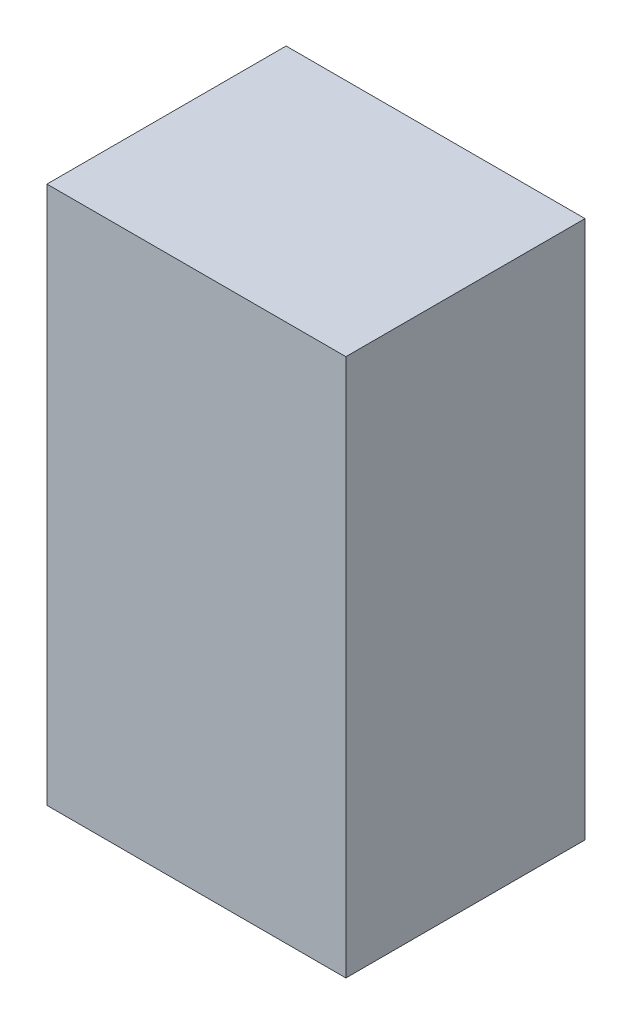
ISO-10303-21;
HEADER;
FILE_DESCRIPTION(('STEP AP214'),'2;1');
FILE_NAME('part.step','',(''),(''),'','','');
FILE_SCHEMA(('AUTOMOTIVE_DESIGN { 1 0 10303 214 1 1 1 1 }'));
ENDSEC;
DATA;
#1=APPLICATION_CONTEXT('core data for automotive mechanical design processes');
#2=APPLICATION_PROTOCOL_DEFINITION('international standard','automotive_design',2000,#1);
#3=PRODUCT_CONTEXT('',#1,'mechanical');
#4=PRODUCT('Part','Part','',(#3));
#5=PRODUCT_RELATED_PRODUCT_CATEGORY('part','',(#4));
#6=PRODUCT_DEFINITION_FORMATION('','',#4);
#7=PRODUCT_DEFINITION_CONTEXT('part definition',#1,'design');
#8=PRODUCT_DEFINITION('design','',#6,#7);
#9=PRODUCT_DEFINITION_SHAPE('','',#8);
#10=(LENGTH_UNIT() NAMED_UNIT(*) SI_UNIT(.MILLI.,.METRE.));
#11=(NAMED_UNIT(*) PLANE_ANGLE_UNIT() SI_UNIT($,.RADIAN.));
#12=(NAMED_UNIT(*) SI_UNIT($,.STERADIAN.) SOLID_ANGLE_UNIT());
#13=UNCERTAINTY_MEASURE_WITH_UNIT(LENGTH_MEASURE(1.E-05),#10,'distance_accuracy_value','');
#14=(GEOMETRIC_REPRESENTATION_CONTEXT(3) GLOBAL_UNCERTAINTY_ASSIGNED_CONTEXT((#13)) GLOBAL_UNIT_ASSIGNED_CONTEXT((#10,
#11,#12)) REPRESENTATION_CONTEXT('',''));
#15=CARTESIAN_POINT('',(0.,0.,0.));
#16=DIRECTION('',(0.,0.,1.));
#17=DIRECTION('',(1.,0.,0.));
#18=AXIS2_PLACEMENT_3D('',#15,#16,#17);
#19=CARTESIAN_POINT('',(105.38151622482,18.457576984053,0.45));
#20=DIRECTION('',(0.,0.,1.));
#21=DIRECTION('',(1.,0.,0.));
#22=AXIS2_PLACEMENT_3D('',#19,#20,#21);
#23=PLANE('',#22);
#24=DIRECTION('',(-1.,-4.371138828674E-08,0.));
#25=VECTOR('',#24,1.);
#26=CARTESIAN_POINT('',(105.38151622482,18.457576984053,0.45));
#27=LINE('',#26,#25);
#28=CARTESIAN_POINT('',(105.38151622482,18.457576984053,0.45));
#29=VERTEX_POINT('',#28);
#30=CARTESIAN_POINT('',(104.88151622482,18.457576962197,0.45));
#31=VERTEX_POINT('',#30);
#32=EDGE_CURVE('E80',#29,#31,#27,.T.);
#33=ORIENTED_EDGE('',*,*,#32,.F.);
#34=DIRECTION('',(-4.371138828674E-08,1.,0.));
#35=VECTOR('',#34,1.);
#36=CARTESIAN_POINT('',(105.38151622482,18.457576984053,0.45));
#37=LINE('',#36,#35);
#38=CARTESIAN_POINT('',(105.38151618548,19.357576984053,0.45));
#39=VERTEX_POINT('',#38);
#40=EDGE_CURVE('E73',#29,#39,#37,.T.);
#41=ORIENTED_EDGE('',*,*,#40,.T.);
#42=DIRECTION('',(-1.,-4.371138828674E-08,0.));
#43=VECTOR('',#42,1.);
#44=CARTESIAN_POINT('',(105.38151618548,19.357576984053,0.45));
#45=LINE('',#44,#43);
#46=CARTESIAN_POINT('',(104.88151618548,19.357576962197,0.45));
#47=VERTEX_POINT('',#46);
#48=EDGE_CURVE('E82',#39,#47,#45,.T.);
#49=ORIENTED_EDGE('',*,*,#48,.T.);
#50=DIRECTION('',(-4.371138828674E-08,1.,0.));
#51=VECTOR('',#50,1.);
#52=CARTESIAN_POINT('',(104.88151622482,18.457576962197,0.45));
#53=LINE('',#52,#51);
#54=EDGE_CURVE('E11',#31,#47,#53,.T.);
#55=ORIENTED_EDGE('',*,*,#54,.F.);
#56=EDGE_LOOP('',(#33,#41,#49,#55));
#57=FACE_BOUND('',#56,.T.);
#58=ADVANCED_FACE('F16',(#57),#23,.T.);
#59=CARTESIAN_POINT('',(105.38151622482,18.457576984053,0.05));
#60=DIRECTION('',(0.,0.,1.));
#61=DIRECTION('',(1.,0.,0.));
#62=AXIS2_PLACEMENT_3D('',#59,#60,#61);
#63=PLANE('',#62);
#64=DIRECTION('',(-4.371138828674E-08,1.,0.));
#65=VECTOR('',#64,1.);
#66=CARTESIAN_POINT('',(104.88151622482,18.457576962197,0.05));
#67=LINE('',#66,#65);
#68=CARTESIAN_POINT('',(104.88151622482,18.457576962197,0.05));
#69=VERTEX_POINT('',#68);
#70=CARTESIAN_POINT('',(104.88151618548,19.357576962197,0.05));
#71=VERTEX_POINT('',#70);
#72=EDGE_CURVE('E27',#69,#71,#67,.T.);
#73=ORIENTED_EDGE('',*,*,#72,.T.);
#74=DIRECTION('',(-1.,-4.371138828674E-08,0.));
#75=VECTOR('',#74,1.);
#76=CARTESIAN_POINT('',(105.38151618548,19.357576984053,0.05));
#77=LINE('',#76,#75);
#78=CARTESIAN_POINT('',(105.38151618548,19.357576984053,0.05));
#79=VERTEX_POINT('',#78);
#80=EDGE_CURVE('E101',#79,#71,#77,.T.);
#81=ORIENTED_EDGE('',*,*,#80,.F.);
#82=DIRECTION('',(-4.371138828674E-08,1.,0.));
#83=VECTOR('',#82,1.);
#84=CARTESIAN_POINT('',(105.38151622482,18.457576984053,0.05));
#85=LINE('',#84,#83);
#86=CARTESIAN_POINT('',(105.38151622482,18.457576984053,0.05));
#87=VERTEX_POINT('',#86);
#88=EDGE_CURVE('E60',#87,#79,#85,.T.);
#89=ORIENTED_EDGE('',*,*,#88,.F.);
#90=DIRECTION('',(-1.,-4.371138828674E-08,0.));
#91=VECTOR('',#90,1.);
#92=CARTESIAN_POINT('',(105.38151622482,18.457576984053,0.05));
#93=LINE('',#92,#91);
#94=EDGE_CURVE('E89',#87,#69,#93,.T.);
#95=ORIENTED_EDGE('',*,*,#94,.T.);
#96=EDGE_LOOP('',(#73,#81,#89,#95));
#97=FACE_BOUND('',#96,.T.);
#98=ADVANCED_FACE('F18',(#97),#63,.F.);
#99=CARTESIAN_POINT('',(104.88151622482,18.457576962197,0.05));
#100=DIRECTION('',(-1.,-4.371138828674E-08,0.));
#101=DIRECTION('',(-4.371138828674E-08,1.,0.));
#102=AXIS2_PLACEMENT_3D('',#99,#100,#101);
#103=PLANE('',#102);
#104=ORIENTED_EDGE('',*,*,#72,.F.);
#105=DIRECTION('',(0.,0.,1.));
#106=VECTOR('',#105,1.);
#107=CARTESIAN_POINT('',(104.88151622482,18.457576962197,0.05));
#108=LINE('',#107,#106);
#109=EDGE_CURVE('E20',#69,#31,#108,.T.);
#110=ORIENTED_EDGE('',*,*,#109,.T.);
#111=ORIENTED_EDGE('',*,*,#54,.T.);
#112=DIRECTION('',(0.,0.,1.));
#113=VECTOR('',#112,1.);
#114=CARTESIAN_POINT('',(104.88151618548,19.357576962197,0.05));
#115=LINE('',#114,#113);
#116=EDGE_CURVE('E105',#71,#47,#115,.T.);
#117=ORIENTED_EDGE('',*,*,#116,.F.);
#118=EDGE_LOOP('',(#104,#110,#111,#117));
#119=FACE_BOUND('',#118,.T.);
#120=ADVANCED_FACE('F85',(#119),#103,.T.);
#121=CARTESIAN_POINT('',(105.38151622482,18.457576984053,0.05));
#122=DIRECTION('',(-1.,-4.371138828674E-08,0.));
#123=DIRECTION('',(-4.371138828674E-08,1.,0.));
#124=AXIS2_PLACEMENT_3D('',#121,#122,#123);
#125=PLANE('',#124);
#126=DIRECTION('',(0.,0.,1.));
#127=VECTOR('',#126,1.);
#128=CARTESIAN_POINT('',(105.38151618548,19.357576984053,0.05));
#129=LINE('',#128,#127);
#130=EDGE_CURVE('E106',#79,#39,#129,.T.);
#131=ORIENTED_EDGE('',*,*,#130,.T.);
#132=ORIENTED_EDGE('',*,*,#40,.F.);
#133=DIRECTION('',(0.,0.,1.));
#134=VECTOR('',#133,1.);
#135=CARTESIAN_POINT('',(105.38151622482,18.457576984053,0.05));
#136=LINE('',#135,#134);
#137=EDGE_CURVE('E91',#87,#29,#136,.T.);
#138=ORIENTED_EDGE('',*,*,#137,.F.);
#139=ORIENTED_EDGE('',*,*,#88,.T.);
#140=EDGE_LOOP('',(#131,#132,#138,#139));
#141=FACE_BOUND('',#140,.T.);
#142=ADVANCED_FACE('F128',(#141),#125,.F.);
#143=CARTESIAN_POINT('',(105.38151618548,19.357576984053,0.05));
#144=DIRECTION('',(-4.371138828674E-08,1.,0.));
#145=DIRECTION('',(0.,0.,1.));
#146=AXIS2_PLACEMENT_3D('',#143,#144,#145);
#147=PLANE('',#146);
#148=ORIENTED_EDGE('',*,*,#130,.F.);
#149=ORIENTED_EDGE('',*,*,#80,.T.);
#150=ORIENTED_EDGE('',*,*,#116,.T.);
#151=ORIENTED_EDGE('',*,*,#48,.F.);
#152=EDGE_LOOP('',(#148,#149,#150,#151));
#153=FACE_BOUND('',#152,.T.);
#154=ADVANCED_FACE('F126',(#153),#147,.T.);
#155=CARTESIAN_POINT('',(105.38151622482,18.457576984053,0.05));
#156=DIRECTION('',(-4.371138828674E-08,1.,0.));
#157=DIRECTION('',(0.,0.,1.));
#158=AXIS2_PLACEMENT_3D('',#155,#156,#157);
#159=PLANE('',#158);
#160=ORIENTED_EDGE('',*,*,#32,.T.);
#161=ORIENTED_EDGE('',*,*,#109,.F.);
#162=ORIENTED_EDGE('',*,*,#94,.F.);
#163=ORIENTED_EDGE('',*,*,#137,.T.);
#164=EDGE_LOOP('',(#160,#161,#162,#163));
#165=FACE_BOUND('',#164,.T.);
#166=ADVANCED_FACE('F90',(#165),#159,.F.);
#167=CLOSED_SHELL('',(#58,#98,#120,#142,#154,#166));
#168=MANIFOLD_SOLID_BREP('B1',#167);
#169=ADVANCED_BREP_SHAPE_REPRESENTATION('',(#18,#168),#14);
#170=SHAPE_DEFINITION_REPRESENTATION(#9,#169);
ENDSEC;
END-ISO-10303-21;
